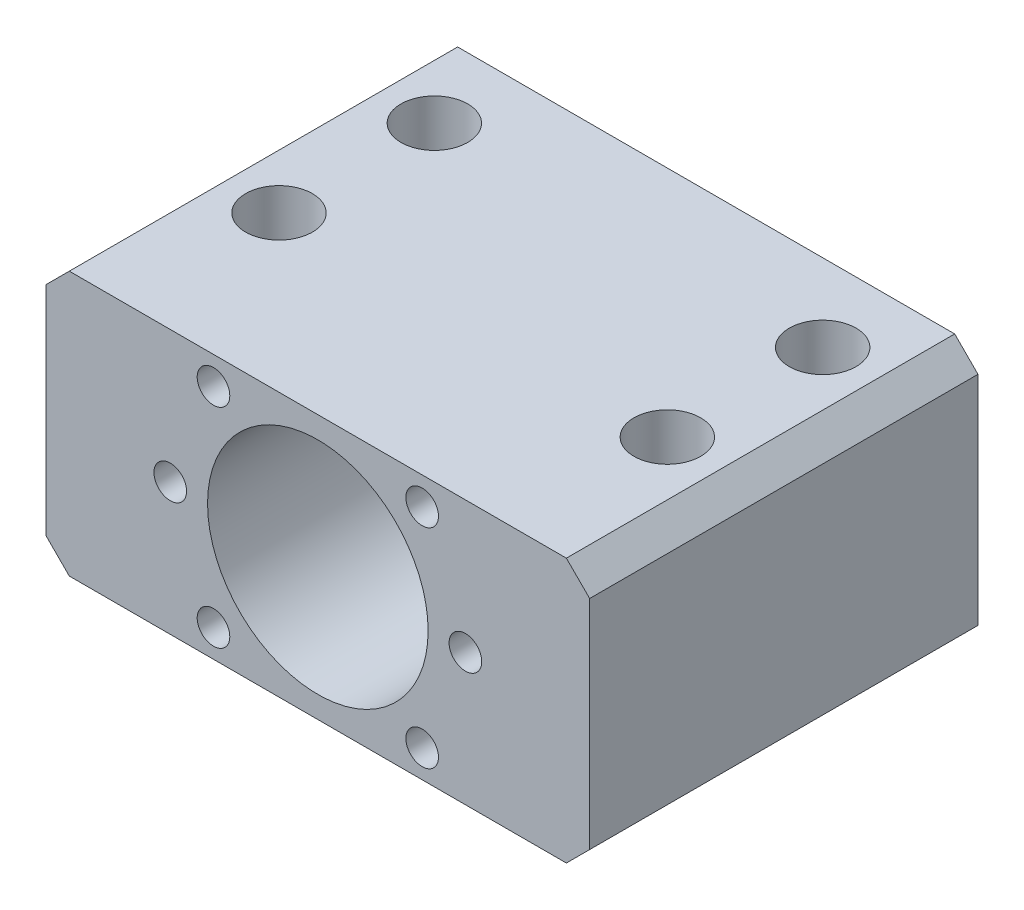
ISO-10303-21;
HEADER;
FILE_DESCRIPTION(('STEP AP214'),'2;1');
FILE_NAME('part.step','',(''),(''),'','','');
FILE_SCHEMA(('AUTOMOTIVE_DESIGN { 1 0 10303 214 1 1 1 1 }'));
ENDSEC;
DATA;
#1=APPLICATION_CONTEXT('core data for automotive mechanical design processes');
#2=APPLICATION_PROTOCOL_DEFINITION('international standard','automotive_design',2000,#1);
#3=PRODUCT_CONTEXT('',#1,'mechanical');
#4=PRODUCT('Part','Part','',(#3));
#5=PRODUCT_RELATED_PRODUCT_CATEGORY('part','',(#4));
#6=PRODUCT_DEFINITION_FORMATION('','',#4);
#7=PRODUCT_DEFINITION_CONTEXT('part definition',#1,'design');
#8=PRODUCT_DEFINITION('design','',#6,#7);
#9=PRODUCT_DEFINITION_SHAPE('','',#8);
#10=(LENGTH_UNIT() NAMED_UNIT(*) SI_UNIT(.MILLI.,.METRE.));
#11=(NAMED_UNIT(*) PLANE_ANGLE_UNIT() SI_UNIT($,.RADIAN.));
#12=(NAMED_UNIT(*) SI_UNIT($,.STERADIAN.) SOLID_ANGLE_UNIT());
#13=UNCERTAINTY_MEASURE_WITH_UNIT(LENGTH_MEASURE(1.E-05),#10,'distance_accuracy_value','');
#14=(GEOMETRIC_REPRESENTATION_CONTEXT(3) GLOBAL_UNCERTAINTY_ASSIGNED_CONTEXT((#13)) GLOBAL_UNIT_ASSIGNED_CONTEXT((#10,
#11,#12)) REPRESENTATION_CONTEXT('',''));
#15=CARTESIAN_POINT('',(0.,0.,0.));
#16=DIRECTION('',(0.,0.,1.));
#17=DIRECTION('',(1.,0.,0.));
#18=AXIS2_PLACEMENT_3D('',#15,#16,#17);
#19=CARTESIAN_POINT('',(-35.,24.,25.));
#20=DIRECTION('',(-1.,0.,0.));
#21=DIRECTION('',(0.,0.,1.));
#22=AXIS2_PLACEMENT_3D('',#19,#20,#21);
#23=PLANE('',#22);
#24=DIRECTION('',(0.,-1.,0.));
#25=VECTOR('',#24,1.);
#26=CARTESIAN_POINT('',(-35.,24.,-25.));
#27=LINE('',#26,#25);
#28=CARTESIAN_POINT('',(-35.,14.,-25.));
#29=VERTEX_POINT('',#28);
#30=CARTESIAN_POINT('',(-35.,-14.,-25.));
#31=VERTEX_POINT('',#30);
#32=EDGE_CURVE('E207',#29,#31,#27,.T.);
#33=ORIENTED_EDGE('',*,*,#32,.T.);
#34=DIRECTION('',(0.,0.,1.));
#35=VECTOR('',#34,1.);
#36=CARTESIAN_POINT('',(-35.,-14.,25.));
#37=LINE('',#36,#35);
#38=CARTESIAN_POINT('',(-35.,-14.,25.));
#39=VERTEX_POINT('',#38);
#40=EDGE_CURVE('E229',#31,#39,#37,.T.);
#41=ORIENTED_EDGE('',*,*,#40,.T.);
#42=DIRECTION('',(0.,-1.,0.));
#43=VECTOR('',#42,1.);
#44=CARTESIAN_POINT('',(-35.,24.,25.));
#45=LINE('',#44,#43);
#46=CARTESIAN_POINT('',(-35.,14.,25.));
#47=VERTEX_POINT('',#46);
#48=EDGE_CURVE('E208',#47,#39,#45,.T.);
#49=ORIENTED_EDGE('',*,*,#48,.F.);
#50=DIRECTION('',(0.,0.,-1.));
#51=VECTOR('',#50,1.);
#52=CARTESIAN_POINT('',(-35.,14.,-25.));
#53=LINE('',#52,#51);
#54=EDGE_CURVE('E211',#47,#29,#53,.T.);
#55=ORIENTED_EDGE('',*,*,#54,.T.);
#56=EDGE_LOOP('',(#33,#41,#49,#55));
#57=FACE_BOUND('',#56,.T.);
#58=ADVANCED_FACE('F35',(#57),#23,.T.);
#59=CARTESIAN_POINT('',(35.,24.,25.));
#60=DIRECTION('',(0.,0.,1.));
#61=DIRECTION('',(1.,0.,0.));
#62=AXIS2_PLACEMENT_3D('',#59,#60,#61);
#63=PLANE('',#62);
#64=ORIENTED_EDGE('',*,*,#48,.T.);
#65=DIRECTION('',(0.707106781186549,-0.707106781186546,0.));
#66=VECTOR('',#65,1.);
#67=CARTESIAN_POINT('',(-18.9999999999998,-30.0000000000001,25.));
#68=LINE('',#67,#66);
#69=CARTESIAN_POINT('',(-32.,-17.,25.));
#70=VERTEX_POINT('',#69);
#71=EDGE_CURVE('E238',#39,#70,#68,.T.);
#72=ORIENTED_EDGE('',*,*,#71,.T.);
#73=DIRECTION('',(-1.,0.,0.));
#74=VECTOR('',#73,1.);
#75=CARTESIAN_POINT('',(-35.,-17.,25.));
#76=LINE('',#75,#74);
#77=CARTESIAN_POINT('',(32.,-17.,25.));
#78=VERTEX_POINT('',#77);
#79=EDGE_CURVE('E284',#78,#70,#76,.T.);
#80=ORIENTED_EDGE('',*,*,#79,.F.);
#81=DIRECTION('',(0.707106781186546,0.707106781186549,0.));
#82=VECTOR('',#81,1.);
#83=CARTESIAN_POINT('',(54.,5.0000000000001,25.));
#84=LINE('',#83,#82);
#85=CARTESIAN_POINT('',(35.,-14.,25.));
#86=VERTEX_POINT('',#85);
#87=EDGE_CURVE('E236',#78,#86,#84,.T.);
#88=ORIENTED_EDGE('',*,*,#87,.T.);
#89=DIRECTION('',(0.,-1.,0.));
#90=VECTOR('',#89,1.);
#91=CARTESIAN_POINT('',(35.,24.,25.));
#92=LINE('',#91,#90);
#93=CARTESIAN_POINT('',(35.,14.,25.));
#94=VERTEX_POINT('',#93);
#95=EDGE_CURVE('E212',#94,#86,#92,.T.);
#96=ORIENTED_EDGE('',*,*,#95,.F.);
#97=DIRECTION('',(-0.707106781186549,0.707106781186546,0.));
#98=VECTOR('',#97,1.);
#99=CARTESIAN_POINT('',(30.,19.,25.));
#100=LINE('',#99,#98);
#101=CARTESIAN_POINT('',(32.,17.,25.));
#102=VERTEX_POINT('',#101);
#103=EDGE_CURVE('E234',#94,#102,#100,.T.);
#104=ORIENTED_EDGE('',*,*,#103,.T.);
#105=DIRECTION('',(1.,0.,0.));
#106=VECTOR('',#105,1.);
#107=CARTESIAN_POINT('',(-35.,17.,25.));
#108=LINE('',#107,#106);
#109=CARTESIAN_POINT('',(-32.,17.,25.));
#110=VERTEX_POINT('',#109);
#111=EDGE_CURVE('E271',#110,#102,#108,.T.);
#112=ORIENTED_EDGE('',*,*,#111,.F.);
#113=DIRECTION('',(-0.707106781186544,-0.707106781186551,0.));
#114=VECTOR('',#113,1.);
#115=CARTESIAN_POINT('',(4.99999999999968,54.,25.));
#116=LINE('',#115,#114);
#117=EDGE_CURVE('E232',#110,#47,#116,.T.);
#118=ORIENTED_EDGE('',*,*,#117,.T.);
#119=EDGE_LOOP('',(#64,#72,#80,#88,#96,#104,#112,#118));
#120=FACE_BOUND('',#119,.T.);
#121=CARTESIAN_POINT('',(13.435028843,-13.435028843,25.));
#122=DIRECTION('',(0.,0.,1.));
#123=DIRECTION('',(1.,0.,0.));
#124=AXIS2_PLACEMENT_3D('',#121,#122,#123);
#125=CIRCLE('',#124,2.09999999999999);
#126=CARTESIAN_POINT('',(15.535028843,-13.435028843,25.));
#127=VERTEX_POINT('',#126);
#128=EDGE_CURVE('E141',#127,#127,#125,.T.);
#129=ORIENTED_EDGE('',*,*,#128,.F.);
#130=EDGE_LOOP('',(#129));
#131=FACE_BOUND('',#130,.T.);
#132=CARTESIAN_POINT('',(13.435028843,13.435028843,25.));
#133=DIRECTION('',(0.,0.,1.));
#134=DIRECTION('',(1.,0.,0.));
#135=AXIS2_PLACEMENT_3D('',#132,#133,#134);
#136=CIRCLE('',#135,2.09999999999999);
#137=CARTESIAN_POINT('',(15.535028843,13.435028843,25.));
#138=VERTEX_POINT('',#137);
#139=EDGE_CURVE('E140',#138,#138,#136,.T.);
#140=ORIENTED_EDGE('',*,*,#139,.F.);
#141=EDGE_LOOP('',(#140));
#142=FACE_BOUND('',#141,.T.);
#143=CARTESIAN_POINT('',(19.,0.,25.));
#144=DIRECTION('',(0.,0.,1.));
#145=DIRECTION('',(1.,0.,0.));
#146=AXIS2_PLACEMENT_3D('',#143,#144,#145);
#147=CIRCLE('',#146,2.09999999999999);
#148=CARTESIAN_POINT('',(21.1,0.,25.));
#149=VERTEX_POINT('',#148);
#150=EDGE_CURVE('E153',#149,#149,#147,.T.);
#151=ORIENTED_EDGE('',*,*,#150,.F.);
#152=EDGE_LOOP('',(#151));
#153=FACE_BOUND('',#152,.T.);
#154=CARTESIAN_POINT('',(-13.435028843,13.435028843,25.));
#155=DIRECTION('',(0.,0.,1.));
#156=DIRECTION('',(1.,0.,0.));
#157=AXIS2_PLACEMENT_3D('',#154,#155,#156);
#158=CIRCLE('',#157,2.09999999999999);
#159=CARTESIAN_POINT('',(-11.335028843,13.435028843,25.));
#160=VERTEX_POINT('',#159);
#161=EDGE_CURVE('E159',#160,#160,#158,.T.);
#162=ORIENTED_EDGE('',*,*,#161,.F.);
#163=EDGE_LOOP('',(#162));
#164=FACE_BOUND('',#163,.T.);
#165=CARTESIAN_POINT('',(-13.435028843,-13.435028843,25.));
#166=DIRECTION('',(0.,0.,1.));
#167=DIRECTION('',(1.,0.,0.));
#168=AXIS2_PLACEMENT_3D('',#165,#166,#167);
#169=CIRCLE('',#168,2.09999999999999);
#170=CARTESIAN_POINT('',(-11.335028843,-13.435028843,25.));
#171=VERTEX_POINT('',#170);
#172=EDGE_CURVE('E165',#171,#171,#169,.T.);
#173=ORIENTED_EDGE('',*,*,#172,.F.);
#174=EDGE_LOOP('',(#173));
#175=FACE_BOUND('',#174,.T.);
#176=CARTESIAN_POINT('',(-19.,0.,25.));
#177=DIRECTION('',(0.,0.,1.));
#178=DIRECTION('',(1.,0.,0.));
#179=AXIS2_PLACEMENT_3D('',#176,#177,#178);
#180=CIRCLE('',#179,2.09999999999999);
#181=CARTESIAN_POINT('',(-16.9,0.,25.));
#182=VERTEX_POINT('',#181);
#183=EDGE_CURVE('E171',#182,#182,#180,.T.);
#184=ORIENTED_EDGE('',*,*,#183,.F.);
#185=EDGE_LOOP('',(#184));
#186=FACE_BOUND('',#185,.T.);
#187=CARTESIAN_POINT('',(0.,0.,25.));
#188=DIRECTION('',(0.,0.,-1.));
#189=DIRECTION('',(-1.,0.,0.));
#190=AXIS2_PLACEMENT_3D('',#187,#188,#189);
#191=CIRCLE('',#190,14.2);
#192=CARTESIAN_POINT('',(-14.2,0.,25.));
#193=VERTEX_POINT('',#192);
#194=EDGE_CURVE('E180',#193,#193,#191,.T.);
#195=ORIENTED_EDGE('',*,*,#194,.T.);
#196=EDGE_LOOP('',(#195));
#197=FACE_BOUND('',#196,.T.);
#198=ADVANCED_FACE('F276',(#120,#131,#142,#153,#164,#175,#186,#197),#63,.T.);
#199=CARTESIAN_POINT('',(35.,24.,-25.));
#200=DIRECTION('',(1.,0.,0.));
#201=DIRECTION('',(0.,0.,-1.));
#202=AXIS2_PLACEMENT_3D('',#199,#200,#201);
#203=PLANE('',#202);
#204=ORIENTED_EDGE('',*,*,#95,.T.);
#205=DIRECTION('',(0.,0.,-1.));
#206=VECTOR('',#205,1.);
#207=CARTESIAN_POINT('',(35.,-14.,-25.));
#208=LINE('',#207,#206);
#209=CARTESIAN_POINT('',(35.,-14.,-25.));
#210=VERTEX_POINT('',#209);
#211=EDGE_CURVE('E51',#86,#210,#208,.T.);
#212=ORIENTED_EDGE('',*,*,#211,.T.);
#213=DIRECTION('',(0.,-1.,0.));
#214=VECTOR('',#213,1.);
#215=CARTESIAN_POINT('',(35.,24.,-25.));
#216=LINE('',#215,#214);
#217=CARTESIAN_POINT('',(35.,14.,-25.));
#218=VERTEX_POINT('',#217);
#219=EDGE_CURVE('E214',#218,#210,#216,.T.);
#220=ORIENTED_EDGE('',*,*,#219,.F.);
#221=DIRECTION('',(0.,0.,1.));
#222=VECTOR('',#221,1.);
#223=CARTESIAN_POINT('',(35.,14.,25.));
#224=LINE('',#223,#222);
#225=EDGE_CURVE('E260',#218,#94,#224,.T.);
#226=ORIENTED_EDGE('',*,*,#225,.T.);
#227=EDGE_LOOP('',(#204,#212,#220,#226));
#228=FACE_BOUND('',#227,.T.);
#229=ADVANCED_FACE('F330',(#228),#203,.T.);
#230=CARTESIAN_POINT('',(-35.,24.,-25.));
#231=DIRECTION('',(0.,0.,-1.));
#232=DIRECTION('',(-1.,0.,0.));
#233=AXIS2_PLACEMENT_3D('',#230,#231,#232);
#234=PLANE('',#233);
#235=DIRECTION('',(-1.,0.,0.));
#236=VECTOR('',#235,1.);
#237=CARTESIAN_POINT('',(-35.,-17.,-25.));
#238=LINE('',#237,#236);
#239=CARTESIAN_POINT('',(32.,-17.,-25.));
#240=VERTEX_POINT('',#239);
#241=CARTESIAN_POINT('',(-32.,-17.,-25.));
#242=VERTEX_POINT('',#241);
#243=EDGE_CURVE('E280',#240,#242,#238,.T.);
#244=ORIENTED_EDGE('',*,*,#243,.T.);
#245=DIRECTION('',(-0.707106781186549,0.707106781186546,0.));
#246=VECTOR('',#245,1.);
#247=CARTESIAN_POINT('',(-54.,4.99999999999993,-25.));
#248=LINE('',#247,#246);
#249=EDGE_CURVE('E258',#242,#31,#248,.T.);
#250=ORIENTED_EDGE('',*,*,#249,.T.);
#251=ORIENTED_EDGE('',*,*,#32,.F.);
#252=DIRECTION('',(0.707106781186544,0.707106781186551,0.));
#253=VECTOR('',#252,1.);
#254=CARTESIAN_POINT('',(-30.,19.,-25.));
#255=LINE('',#254,#253);
#256=CARTESIAN_POINT('',(-32.,17.,-25.));
#257=VERTEX_POINT('',#256);
#258=EDGE_CURVE('E253',#29,#257,#255,.T.);
#259=ORIENTED_EDGE('',*,*,#258,.T.);
#260=DIRECTION('',(1.,0.,0.));
#261=VECTOR('',#260,1.);
#262=CARTESIAN_POINT('',(-35.,17.,-25.));
#263=LINE('',#262,#261);
#264=CARTESIAN_POINT('',(32.,17.,-25.));
#265=VERTEX_POINT('',#264);
#266=EDGE_CURVE('E222',#257,#265,#263,.T.);
#267=ORIENTED_EDGE('',*,*,#266,.T.);
#268=DIRECTION('',(0.707106781186549,-0.707106781186546,0.));
#269=VECTOR('',#268,1.);
#270=CARTESIAN_POINT('',(-5.00000000000016,54.,-25.));
#271=LINE('',#270,#269);
#272=EDGE_CURVE('E58',#265,#218,#271,.T.);
#273=ORIENTED_EDGE('',*,*,#272,.T.);
#274=ORIENTED_EDGE('',*,*,#219,.T.);
#275=DIRECTION('',(-0.707106781186546,-0.707106781186549,0.));
#276=VECTOR('',#275,1.);
#277=CARTESIAN_POINT('',(19.0000000000002,-29.9999999999999,-25.));
#278=LINE('',#277,#276);
#279=EDGE_CURVE('E256',#210,#240,#278,.T.);
#280=ORIENTED_EDGE('',*,*,#279,.T.);
#281=EDGE_LOOP('',(#244,#250,#251,#259,#267,#273,#274,#280));
#282=FACE_BOUND('',#281,.T.);
#283=CARTESIAN_POINT('',(0.,0.,-25.));
#284=DIRECTION('',(0.,0.,-1.));
#285=DIRECTION('',(-1.,0.,0.));
#286=AXIS2_PLACEMENT_3D('',#283,#284,#285);
#287=CIRCLE('',#286,14.2);
#288=CARTESIAN_POINT('',(-14.2,0.,-25.));
#289=VERTEX_POINT('',#288);
#290=EDGE_CURVE('E177',#289,#289,#287,.T.);
#291=ORIENTED_EDGE('',*,*,#290,.F.);
#292=EDGE_LOOP('',(#291));
#293=FACE_BOUND('',#292,.T.);
#294=ADVANCED_FACE('F334',(#282,#293),#234,.T.);
#295=CARTESIAN_POINT('',(0.,0.,-25.));
#296=DIRECTION('',(0.,0.,-1.));
#297=DIRECTION('',(-1.,0.,0.));
#298=AXIS2_PLACEMENT_3D('',#295,#296,#297);
#299=CYLINDRICAL_SURFACE('',#298,14.2);
#300=ORIENTED_EDGE('',*,*,#194,.F.);
#301=EDGE_LOOP('',(#300));
#302=FACE_BOUND('',#301,.T.);
#303=ORIENTED_EDGE('',*,*,#290,.T.);
#304=EDGE_LOOP('',(#303));
#305=FACE_BOUND('',#304,.T.);
#306=ADVANCED_FACE('F419',(#302,#305),#299,.F.);
#307=CARTESIAN_POINT('',(-19.,0.,11.));
#308=DIRECTION('',(0.,0.,1.));
#309=DIRECTION('',(1.,0.,0.));
#310=AXIS2_PLACEMENT_3D('',#307,#308,#309);
#311=CONICAL_SURFACE('',#310,2.09999999999999,1.02974425866172);
#312=CARTESIAN_POINT('',(-19.,0.,9.73819269999946));
#313=VERTEX_POINT('',#312);
#314=VERTEX_LOOP('',#313);
#315=FACE_BOUND('',#314,.T.);
#316=CARTESIAN_POINT('',(-19.,0.,11.));
#317=DIRECTION('',(0.,0.,1.));
#318=DIRECTION('',(1.,0.,0.));
#319=AXIS2_PLACEMENT_3D('',#316,#317,#318);
#320=CIRCLE('',#319,2.09999999999999);
#321=CARTESIAN_POINT('',(-16.9,0.,11.));
#322=VERTEX_POINT('',#321);
#323=EDGE_CURVE('E174',#322,#322,#320,.T.);
#324=ORIENTED_EDGE('',*,*,#323,.T.);
#325=EDGE_LOOP('',(#324));
#326=FACE_BOUND('',#325,.T.);
#327=ADVANCED_FACE('F423',(#315,#326),#311,.F.);
#328=CARTESIAN_POINT('',(-19.,0.,25.));
#329=DIRECTION('',(0.,0.,1.));
#330=DIRECTION('',(1.,0.,0.));
#331=AXIS2_PLACEMENT_3D('',#328,#329,#330);
#332=CYLINDRICAL_SURFACE('',#331,2.09999999999999);
#333=ORIENTED_EDGE('',*,*,#323,.F.);
#334=EDGE_LOOP('',(#333));
#335=FACE_BOUND('',#334,.T.);
#336=ORIENTED_EDGE('',*,*,#183,.T.);
#337=EDGE_LOOP('',(#336));
#338=FACE_BOUND('',#337,.T.);
#339=ADVANCED_FACE('F429',(#335,#338),#332,.F.);
#340=CARTESIAN_POINT('',(-13.435028843,-13.435028843,11.));
#341=DIRECTION('',(0.,0.,1.));
#342=DIRECTION('',(1.,0.,0.));
#343=AXIS2_PLACEMENT_3D('',#340,#341,#342);
#344=CONICAL_SURFACE('',#343,2.09999999999999,1.02974425866172);
#345=CARTESIAN_POINT('',(-13.435028843,-13.435028843,9.73819269999946));
#346=VERTEX_POINT('',#345);
#347=VERTEX_LOOP('',#346);
#348=FACE_BOUND('',#347,.T.);
#349=CARTESIAN_POINT('',(-13.435028843,-13.435028843,11.));
#350=DIRECTION('',(0.,0.,1.));
#351=DIRECTION('',(1.,0.,0.));
#352=AXIS2_PLACEMENT_3D('',#349,#350,#351);
#353=CIRCLE('',#352,2.09999999999999);
#354=CARTESIAN_POINT('',(-11.335028843,-13.435028843,11.));
#355=VERTEX_POINT('',#354);
#356=EDGE_CURVE('E168',#355,#355,#353,.T.);
#357=ORIENTED_EDGE('',*,*,#356,.T.);
#358=EDGE_LOOP('',(#357));
#359=FACE_BOUND('',#358,.T.);
#360=ADVANCED_FACE('F572',(#348,#359),#344,.F.);
#361=CARTESIAN_POINT('',(-13.435028843,-13.435028843,25.));
#362=DIRECTION('',(0.,0.,1.));
#363=DIRECTION('',(1.,0.,0.));
#364=AXIS2_PLACEMENT_3D('',#361,#362,#363);
#365=CYLINDRICAL_SURFACE('',#364,2.09999999999999);
#366=ORIENTED_EDGE('',*,*,#356,.F.);
#367=EDGE_LOOP('',(#366));
#368=FACE_BOUND('',#367,.T.);
#369=ORIENTED_EDGE('',*,*,#172,.T.);
#370=EDGE_LOOP('',(#369));
#371=FACE_BOUND('',#370,.T.);
#372=ADVANCED_FACE('F563',(#368,#371),#365,.F.);
#373=CARTESIAN_POINT('',(-13.435028843,13.435028843,11.));
#374=DIRECTION('',(0.,0.,1.));
#375=DIRECTION('',(1.,0.,0.));
#376=AXIS2_PLACEMENT_3D('',#373,#374,#375);
#377=CONICAL_SURFACE('',#376,2.09999999999999,1.02974425866172);
#378=CARTESIAN_POINT('',(-13.435028843,13.435028843,9.73819269999946));
#379=VERTEX_POINT('',#378);
#380=VERTEX_LOOP('',#379);
#381=FACE_BOUND('',#380,.T.);
#382=CARTESIAN_POINT('',(-13.435028843,13.435028843,11.));
#383=DIRECTION('',(0.,0.,1.));
#384=DIRECTION('',(1.,0.,0.));
#385=AXIS2_PLACEMENT_3D('',#382,#383,#384);
#386=CIRCLE('',#385,2.09999999999999);
#387=CARTESIAN_POINT('',(-11.335028843,13.435028843,11.));
#388=VERTEX_POINT('',#387);
#389=EDGE_CURVE('E162',#388,#388,#386,.T.);
#390=ORIENTED_EDGE('',*,*,#389,.T.);
#391=EDGE_LOOP('',(#390));
#392=FACE_BOUND('',#391,.T.);
#393=ADVANCED_FACE('F554',(#381,#392),#377,.F.);
#394=CARTESIAN_POINT('',(-13.435028843,13.435028843,25.));
#395=DIRECTION('',(0.,0.,1.));
#396=DIRECTION('',(1.,0.,0.));
#397=AXIS2_PLACEMENT_3D('',#394,#395,#396);
#398=CYLINDRICAL_SURFACE('',#397,2.09999999999999);
#399=ORIENTED_EDGE('',*,*,#389,.F.);
#400=EDGE_LOOP('',(#399));
#401=FACE_BOUND('',#400,.T.);
#402=ORIENTED_EDGE('',*,*,#161,.T.);
#403=EDGE_LOOP('',(#402));
#404=FACE_BOUND('',#403,.T.);
#405=ADVANCED_FACE('F545',(#401,#404),#398,.F.);
#406=CARTESIAN_POINT('',(19.,0.,11.));
#407=DIRECTION('',(0.,0.,1.));
#408=DIRECTION('',(1.,0.,0.));
#409=AXIS2_PLACEMENT_3D('',#406,#407,#408);
#410=CONICAL_SURFACE('',#409,2.09999999999999,1.02974425866172);
#411=CARTESIAN_POINT('',(19.,0.,9.73819269999946));
#412=VERTEX_POINT('',#411);
#413=VERTEX_LOOP('',#412);
#414=FACE_BOUND('',#413,.T.);
#415=CARTESIAN_POINT('',(19.,0.,11.));
#416=DIRECTION('',(0.,0.,1.));
#417=DIRECTION('',(1.,0.,0.));
#418=AXIS2_PLACEMENT_3D('',#415,#416,#417);
#419=CIRCLE('',#418,2.09999999999999);
#420=CARTESIAN_POINT('',(21.1,0.,11.));
#421=VERTEX_POINT('',#420);
#422=EDGE_CURVE('E156',#421,#421,#419,.T.);
#423=ORIENTED_EDGE('',*,*,#422,.T.);
#424=EDGE_LOOP('',(#423));
#425=FACE_BOUND('',#424,.T.);
#426=ADVANCED_FACE('F536',(#414,#425),#410,.F.);
#427=CARTESIAN_POINT('',(19.,0.,25.));
#428=DIRECTION('',(0.,0.,1.));
#429=DIRECTION('',(1.,0.,0.));
#430=AXIS2_PLACEMENT_3D('',#427,#428,#429);
#431=CYLINDRICAL_SURFACE('',#430,2.09999999999999);
#432=ORIENTED_EDGE('',*,*,#422,.F.);
#433=EDGE_LOOP('',(#432));
#434=FACE_BOUND('',#433,.T.);
#435=ORIENTED_EDGE('',*,*,#150,.T.);
#436=EDGE_LOOP('',(#435));
#437=FACE_BOUND('',#436,.T.);
#438=ADVANCED_FACE('F527',(#434,#437),#431,.F.);
#439=CARTESIAN_POINT('',(13.435028843,13.435028843,11.));
#440=DIRECTION('',(0.,0.,1.));
#441=DIRECTION('',(1.,0.,0.));
#442=AXIS2_PLACEMENT_3D('',#439,#440,#441);
#443=CONICAL_SURFACE('',#442,2.09999999999999,1.02974425866172);
#444=CARTESIAN_POINT('',(13.435028843,13.435028843,9.73819269999946));
#445=VERTEX_POINT('',#444);
#446=VERTEX_LOOP('',#445);
#447=FACE_BOUND('',#446,.T.);
#448=CARTESIAN_POINT('',(13.435028843,13.435028843,11.));
#449=DIRECTION('',(0.,0.,1.));
#450=DIRECTION('',(1.,0.,0.));
#451=AXIS2_PLACEMENT_3D('',#448,#449,#450);
#452=CIRCLE('',#451,2.09999999999999);
#453=CARTESIAN_POINT('',(15.535028843,13.435028843,11.));
#454=VERTEX_POINT('',#453);
#455=EDGE_CURVE('E144',#454,#454,#452,.T.);
#456=ORIENTED_EDGE('',*,*,#455,.T.);
#457=EDGE_LOOP('',(#456));
#458=FACE_BOUND('',#457,.T.);
#459=ADVANCED_FACE('F518',(#447,#458),#443,.F.);
#460=CARTESIAN_POINT('',(13.435028843,13.435028843,25.));
#461=DIRECTION('',(0.,0.,1.));
#462=DIRECTION('',(1.,0.,0.));
#463=AXIS2_PLACEMENT_3D('',#460,#461,#462);
#464=CYLINDRICAL_SURFACE('',#463,2.09999999999999);
#465=ORIENTED_EDGE('',*,*,#455,.F.);
#466=EDGE_LOOP('',(#465));
#467=FACE_BOUND('',#466,.T.);
#468=ORIENTED_EDGE('',*,*,#139,.T.);
#469=EDGE_LOOP('',(#468));
#470=FACE_BOUND('',#469,.T.);
#471=ADVANCED_FACE('F134',(#467,#470),#464,.F.);
#472=CARTESIAN_POINT('',(13.435028843,-13.435028843,11.));
#473=DIRECTION('',(0.,0.,1.));
#474=DIRECTION('',(1.,0.,0.));
#475=AXIS2_PLACEMENT_3D('',#472,#473,#474);
#476=CONICAL_SURFACE('',#475,2.09999999999999,1.02974425866172);
#477=CARTESIAN_POINT('',(13.435028843,-13.435028843,9.73819269999946));
#478=VERTEX_POINT('',#477);
#479=VERTEX_LOOP('',#478);
#480=FACE_BOUND('',#479,.T.);
#481=CARTESIAN_POINT('',(13.435028843,-13.435028843,11.));
#482=DIRECTION('',(0.,0.,1.));
#483=DIRECTION('',(1.,0.,0.));
#484=AXIS2_PLACEMENT_3D('',#481,#482,#483);
#485=CIRCLE('',#484,2.09999999999999);
#486=CARTESIAN_POINT('',(15.535028843,-13.435028843,11.));
#487=VERTEX_POINT('',#486);
#488=EDGE_CURVE('E138',#487,#487,#485,.T.);
#489=ORIENTED_EDGE('',*,*,#488,.T.);
#490=EDGE_LOOP('',(#489));
#491=FACE_BOUND('',#490,.T.);
#492=ADVANCED_FACE('F130',(#480,#491),#476,.F.);
#493=CARTESIAN_POINT('',(13.435028843,-13.435028843,25.));
#494=DIRECTION('',(0.,0.,1.));
#495=DIRECTION('',(1.,0.,0.));
#496=AXIS2_PLACEMENT_3D('',#493,#494,#495);
#497=CYLINDRICAL_SURFACE('',#496,2.09999999999999);
#498=ORIENTED_EDGE('',*,*,#488,.F.);
#499=EDGE_LOOP('',(#498));
#500=FACE_BOUND('',#499,.T.);
#501=ORIENTED_EDGE('',*,*,#128,.T.);
#502=EDGE_LOOP('',(#501));
#503=FACE_BOUND('',#502,.T.);
#504=ADVANCED_FACE('F133',(#500,#503),#497,.F.);
#505=CARTESIAN_POINT('',(-35.,-17.,-25.));
#506=DIRECTION('',(0.,1.,0.));
#507=DIRECTION('',(-1.,0.,0.));
#508=AXIS2_PLACEMENT_3D('',#505,#506,#507);
#509=PLANE('',#508);
#510=ORIENTED_EDGE('',*,*,#79,.T.);
#511=DIRECTION('',(0.,0.,-1.));
#512=VECTOR('',#511,1.);
#513=CARTESIAN_POINT('',(-32.,-17.,-25.));
#514=LINE('',#513,#512);
#515=CARTESIAN_POINT('',(-32.,-17.,5.));
#516=VERTEX_POINT('',#515);
#517=EDGE_CURVE('E251',#70,#516,#514,.T.);
#518=ORIENTED_EDGE('',*,*,#517,.T.);
#519=CARTESIAN_POINT('',(-25.,-17.,5.));
#520=DIRECTION('',(0.,1.,0.));
#521=DIRECTION('',(-1.,0.,0.));
#522=AXIS2_PLACEMENT_3D('',#519,#520,#521);
#523=CIRCLE('',#522,7.);
#524=EDGE_CURVE('E218',#516,#516,#523,.F.);
#525=ORIENTED_EDGE('',*,*,#524,.F.);
#526=DIRECTION('',(0.,0.,-1.));
#527=VECTOR('',#526,1.);
#528=CARTESIAN_POINT('',(-32.,-17.,-25.));
#529=LINE('',#528,#527);
#530=CARTESIAN_POINT('',(-32.,-17.,-15.));
#531=VERTEX_POINT('',#530);
#532=EDGE_CURVE('E249',#516,#531,#529,.T.);
#533=ORIENTED_EDGE('',*,*,#532,.T.);
#534=CARTESIAN_POINT('',(-25.,-17.,-15.));
#535=DIRECTION('',(0.,1.,0.));
#536=DIRECTION('',(-1.,0.,0.));
#537=AXIS2_PLACEMENT_3D('',#534,#535,#536);
#538=CIRCLE('',#537,7.);
#539=EDGE_CURVE('E227',#531,#531,#538,.F.);
#540=ORIENTED_EDGE('',*,*,#539,.F.);
#541=DIRECTION('',(0.,0.,-1.));
#542=VECTOR('',#541,1.);
#543=CARTESIAN_POINT('',(-32.,-17.,-25.));
#544=LINE('',#543,#542);
#545=EDGE_CURVE('E247',#531,#242,#544,.T.);
#546=ORIENTED_EDGE('',*,*,#545,.T.);
#547=ORIENTED_EDGE('',*,*,#243,.F.);
#548=DIRECTION('',(0.,0.,1.));
#549=VECTOR('',#548,1.);
#550=CARTESIAN_POINT('',(32.,-17.,25.));
#551=LINE('',#550,#549);
#552=CARTESIAN_POINT('',(32.,-17.,-15.));
#553=VERTEX_POINT('',#552);
#554=EDGE_CURVE('E244',#240,#553,#551,.T.);
#555=ORIENTED_EDGE('',*,*,#554,.T.);
#556=CARTESIAN_POINT('',(25.,-17.,-15.));
#557=DIRECTION('',(0.,1.,0.));
#558=DIRECTION('',(-1.,0.,0.));
#559=AXIS2_PLACEMENT_3D('',#556,#557,#558);
#560=CIRCLE('',#559,7.);
#561=EDGE_CURVE('E291',#553,#553,#560,.F.);
#562=ORIENTED_EDGE('',*,*,#561,.F.);
#563=DIRECTION('',(0.,0.,1.));
#564=VECTOR('',#563,1.);
#565=CARTESIAN_POINT('',(32.,-17.,25.));
#566=LINE('',#565,#564);
#567=CARTESIAN_POINT('',(32.,-17.,5.));
#568=VERTEX_POINT('',#567);
#569=EDGE_CURVE('E242',#553,#568,#566,.T.);
#570=ORIENTED_EDGE('',*,*,#569,.T.);
#571=CARTESIAN_POINT('',(25.,-17.,5.));
#572=DIRECTION('',(0.,1.,0.));
#573=DIRECTION('',(-1.,0.,0.));
#574=AXIS2_PLACEMENT_3D('',#571,#572,#573);
#575=CIRCLE('',#574,7.);
#576=EDGE_CURVE('E221',#568,#568,#575,.F.);
#577=ORIENTED_EDGE('',*,*,#576,.F.);
#578=DIRECTION('',(0.,0.,1.));
#579=VECTOR('',#578,1.);
#580=CARTESIAN_POINT('',(32.,-17.,25.));
#581=LINE('',#580,#579);
#582=EDGE_CURVE('E240',#568,#78,#581,.T.);
#583=ORIENTED_EDGE('',*,*,#582,.T.);
#584=EDGE_LOOP('',(#510,#518,#525,#533,#540,#546,#547,#555,#562,#570,#577,#583));
#585=FACE_BOUND('',#584,.T.);
#586=ADVANCED_FACE('F308',(#585),#509,.F.);
#587=CARTESIAN_POINT('',(-35.,17.,-25.));
#588=DIRECTION('',(0.,-1.,0.));
#589=DIRECTION('',(0.,0.,-1.));
#590=AXIS2_PLACEMENT_3D('',#587,#588,#589);
#591=PLANE('',#590);
#592=CARTESIAN_POINT('',(25.,17.,-15.));
#593=DIRECTION('',(0.,-1.,0.));
#594=DIRECTION('',(0.,0.,-1.));
#595=AXIS2_PLACEMENT_3D('',#592,#593,#594);
#596=CIRCLE('',#595,4.3);
#597=CARTESIAN_POINT('',(25.,17.,-19.3));
#598=VERTEX_POINT('',#597);
#599=EDGE_CURVE('E298',#598,#598,#596,.F.);
#600=ORIENTED_EDGE('',*,*,#599,.F.);
#601=EDGE_LOOP('',(#600));
#602=FACE_BOUND('',#601,.T.);
#603=CARTESIAN_POINT('',(-25.,17.,5.));
#604=DIRECTION('',(0.,-1.,0.));
#605=DIRECTION('',(0.,0.,-1.));
#606=AXIS2_PLACEMENT_3D('',#603,#604,#605);
#607=CIRCLE('',#606,4.3);
#608=CARTESIAN_POINT('',(-25.,17.,0.7));
#609=VERTEX_POINT('',#608);
#610=EDGE_CURVE('E223',#609,#609,#607,.F.);
#611=ORIENTED_EDGE('',*,*,#610,.F.);
#612=EDGE_LOOP('',(#611));
#613=FACE_BOUND('',#612,.T.);
#614=ORIENTED_EDGE('',*,*,#111,.T.);
#615=DIRECTION('',(0.,0.,-1.));
#616=VECTOR('',#615,1.);
#617=CARTESIAN_POINT('',(32.,17.,-25.));
#618=LINE('',#617,#616);
#619=EDGE_CURVE('E11',#102,#265,#618,.T.);
#620=ORIENTED_EDGE('',*,*,#619,.T.);
#621=ORIENTED_EDGE('',*,*,#266,.F.);
#622=DIRECTION('',(0.,0.,1.));
#623=VECTOR('',#622,1.);
#624=CARTESIAN_POINT('',(-32.,17.,25.));
#625=LINE('',#624,#623);
#626=EDGE_CURVE('E44',#257,#110,#625,.T.);
#627=ORIENTED_EDGE('',*,*,#626,.T.);
#628=EDGE_LOOP('',(#614,#620,#621,#627));
#629=FACE_BOUND('',#628,.T.);
#630=CARTESIAN_POINT('',(25.,17.,5.));
#631=DIRECTION('',(0.,-1.,0.));
#632=DIRECTION('',(0.,0.,-1.));
#633=AXIS2_PLACEMENT_3D('',#630,#631,#632);
#634=CIRCLE('',#633,4.3);
#635=CARTESIAN_POINT('',(25.,17.,0.7));
#636=VERTEX_POINT('',#635);
#637=EDGE_CURVE('E226',#636,#636,#634,.F.);
#638=ORIENTED_EDGE('',*,*,#637,.F.);
#639=EDGE_LOOP('',(#638));
#640=FACE_BOUND('',#639,.T.);
#641=CARTESIAN_POINT('',(-25.,17.,-15.));
#642=DIRECTION('',(0.,-1.,0.));
#643=DIRECTION('',(0.,0.,-1.));
#644=AXIS2_PLACEMENT_3D('',#641,#642,#643);
#645=CIRCLE('',#644,4.3);
#646=CARTESIAN_POINT('',(-25.,17.,-19.3));
#647=VERTEX_POINT('',#646);
#648=EDGE_CURVE('E147',#647,#647,#645,.F.);
#649=ORIENTED_EDGE('',*,*,#648,.F.);
#650=EDGE_LOOP('',(#649));
#651=FACE_BOUND('',#650,.T.);
#652=ADVANCED_FACE('F269',(#602,#613,#629,#640,#651),#591,.F.);
#653=CARTESIAN_POINT('',(25.,-24.,5.));
#654=DIRECTION('',(0.,-1.,0.));
#655=DIRECTION('',(0.,0.,-1.));
#656=AXIS2_PLACEMENT_3D('',#653,#654,#655);
#657=CYLINDRICAL_SURFACE('',#656,4.3);
#658=ORIENTED_EDGE('',*,*,#637,.T.);
#659=EDGE_LOOP('',(#658));
#660=FACE_BOUND('',#659,.T.);
#661=CARTESIAN_POINT('',(25.,-13.,5.));
#662=DIRECTION('',(0.,-1.,0.));
#663=DIRECTION('',(0.,0.,-1.));
#664=AXIS2_PLACEMENT_3D('',#661,#662,#663);
#665=CIRCLE('',#664,4.30000000000001);
#666=CARTESIAN_POINT('',(25.,-13.,0.699999999999995));
#667=VERTEX_POINT('',#666);
#668=EDGE_CURVE('E192',#667,#667,#665,.T.);
#669=ORIENTED_EDGE('',*,*,#668,.T.);
#670=EDGE_LOOP('',(#669));
#671=FACE_BOUND('',#670,.T.);
#672=ADVANCED_FACE('F307',(#660,#671),#657,.F.);
#673=CARTESIAN_POINT('',(29.3,-13.,5.));
#674=DIRECTION('',(0.,1.,0.));
#675=DIRECTION('',(0.,0.,1.));
#676=AXIS2_PLACEMENT_3D('',#673,#674,#675);
#677=PLANE('',#676);
#678=ORIENTED_EDGE('',*,*,#668,.F.);
#679=EDGE_LOOP('',(#678));
#680=FACE_BOUND('',#679,.T.);
#681=CARTESIAN_POINT('',(25.,-13.,5.));
#682=DIRECTION('',(0.,-1.,0.));
#683=DIRECTION('',(0.,0.,-1.));
#684=AXIS2_PLACEMENT_3D('',#681,#682,#683);
#685=CIRCLE('',#684,7.);
#686=CARTESIAN_POINT('',(25.,-13.,-2.));
#687=VERTEX_POINT('',#686);
#688=EDGE_CURVE('E189',#687,#687,#685,.T.);
#689=ORIENTED_EDGE('',*,*,#688,.T.);
#690=EDGE_LOOP('',(#689));
#691=FACE_BOUND('',#690,.T.);
#692=ADVANCED_FACE('F316',(#680,#691),#677,.F.);
#693=CARTESIAN_POINT('',(25.,-24.,5.));
#694=DIRECTION('',(0.,-1.,0.));
#695=DIRECTION('',(0.,0.,-1.));
#696=AXIS2_PLACEMENT_3D('',#693,#694,#695);
#697=CYLINDRICAL_SURFACE('',#696,7.);
#698=ORIENTED_EDGE('',*,*,#576,.T.);
#699=EDGE_LOOP('',(#698));
#700=FACE_BOUND('',#699,.T.);
#701=ORIENTED_EDGE('',*,*,#688,.F.);
#702=EDGE_LOOP('',(#701));
#703=FACE_BOUND('',#702,.T.);
#704=ADVANCED_FACE('F379',(#700,#703),#697,.F.);
#705=CARTESIAN_POINT('',(25.,-24.,-15.));
#706=DIRECTION('',(0.,-1.,0.));
#707=DIRECTION('',(0.,0.,-1.));
#708=AXIS2_PLACEMENT_3D('',#705,#706,#707);
#709=CYLINDRICAL_SURFACE('',#708,4.3);
#710=ORIENTED_EDGE('',*,*,#599,.T.);
#711=EDGE_LOOP('',(#710));
#712=FACE_BOUND('',#711,.T.);
#713=CARTESIAN_POINT('',(25.,-13.,-15.));
#714=DIRECTION('',(0.,-1.,0.));
#715=DIRECTION('',(0.,0.,-1.));
#716=AXIS2_PLACEMENT_3D('',#713,#714,#715);
#717=CIRCLE('',#716,4.30000000000001);
#718=CARTESIAN_POINT('',(25.,-13.,-19.3));
#719=VERTEX_POINT('',#718);
#720=EDGE_CURVE('E198',#719,#719,#717,.T.);
#721=ORIENTED_EDGE('',*,*,#720,.T.);
#722=EDGE_LOOP('',(#721));
#723=FACE_BOUND('',#722,.T.);
#724=ADVANCED_FACE('F381',(#712,#723),#709,.F.);
#725=CARTESIAN_POINT('',(29.3,-13.,-15.));
#726=DIRECTION('',(0.,1.,0.));
#727=DIRECTION('',(0.,0.,1.));
#728=AXIS2_PLACEMENT_3D('',#725,#726,#727);
#729=PLANE('',#728);
#730=ORIENTED_EDGE('',*,*,#720,.F.);
#731=EDGE_LOOP('',(#730));
#732=FACE_BOUND('',#731,.T.);
#733=CARTESIAN_POINT('',(25.,-13.,-15.));
#734=DIRECTION('',(0.,-1.,0.));
#735=DIRECTION('',(0.,0.,-1.));
#736=AXIS2_PLACEMENT_3D('',#733,#734,#735);
#737=CIRCLE('',#736,7.);
#738=CARTESIAN_POINT('',(25.,-13.,-22.));
#739=VERTEX_POINT('',#738);
#740=EDGE_CURVE('E195',#739,#739,#737,.T.);
#741=ORIENTED_EDGE('',*,*,#740,.T.);
#742=EDGE_LOOP('',(#741));
#743=FACE_BOUND('',#742,.T.);
#744=ADVANCED_FACE('F397',(#732,#743),#729,.F.);
#745=CARTESIAN_POINT('',(25.,-24.,-15.));
#746=DIRECTION('',(0.,-1.,0.));
#747=DIRECTION('',(0.,0.,-1.));
#748=AXIS2_PLACEMENT_3D('',#745,#746,#747);
#749=CYLINDRICAL_SURFACE('',#748,7.);
#750=ORIENTED_EDGE('',*,*,#561,.T.);
#751=EDGE_LOOP('',(#750));
#752=FACE_BOUND('',#751,.T.);
#753=ORIENTED_EDGE('',*,*,#740,.F.);
#754=EDGE_LOOP('',(#753));
#755=FACE_BOUND('',#754,.T.);
#756=ADVANCED_FACE('F394',(#752,#755),#749,.F.);
#757=CARTESIAN_POINT('',(-25.,-24.,-15.));
#758=DIRECTION('',(0.,-1.,0.));
#759=DIRECTION('',(0.,0.,-1.));
#760=AXIS2_PLACEMENT_3D('',#757,#758,#759);
#761=CYLINDRICAL_SURFACE('',#760,4.3);
#762=ORIENTED_EDGE('',*,*,#648,.T.);
#763=EDGE_LOOP('',(#762));
#764=FACE_BOUND('',#763,.T.);
#765=CARTESIAN_POINT('',(-25.,-13.,-15.));
#766=DIRECTION('',(0.,-1.,0.));
#767=DIRECTION('',(0.,0.,-1.));
#768=AXIS2_PLACEMENT_3D('',#765,#766,#767);
#769=CIRCLE('',#768,4.30000000000001);
#770=CARTESIAN_POINT('',(-25.,-13.,-19.3));
#771=VERTEX_POINT('',#770);
#772=EDGE_CURVE('E204',#771,#771,#769,.T.);
#773=ORIENTED_EDGE('',*,*,#772,.T.);
#774=EDGE_LOOP('',(#773));
#775=FACE_BOUND('',#774,.T.);
#776=ADVANCED_FACE('F303',(#764,#775),#761,.F.);
#777=CARTESIAN_POINT('',(-20.7,-13.,-15.));
#778=DIRECTION('',(0.,1.,0.));
#779=DIRECTION('',(0.,0.,1.));
#780=AXIS2_PLACEMENT_3D('',#777,#778,#779);
#781=PLANE('',#780);
#782=ORIENTED_EDGE('',*,*,#772,.F.);
#783=EDGE_LOOP('',(#782));
#784=FACE_BOUND('',#783,.T.);
#785=CARTESIAN_POINT('',(-25.,-13.,-15.));
#786=DIRECTION('',(0.,-1.,0.));
#787=DIRECTION('',(0.,0.,-1.));
#788=AXIS2_PLACEMENT_3D('',#785,#786,#787);
#789=CIRCLE('',#788,7.);
#790=CARTESIAN_POINT('',(-25.,-13.,-22.));
#791=VERTEX_POINT('',#790);
#792=EDGE_CURVE('E201',#791,#791,#789,.T.);
#793=ORIENTED_EDGE('',*,*,#792,.T.);
#794=EDGE_LOOP('',(#793));
#795=FACE_BOUND('',#794,.T.);
#796=ADVANCED_FACE('F409',(#784,#795),#781,.F.);
#797=CARTESIAN_POINT('',(-25.,-24.,-15.));
#798=DIRECTION('',(0.,-1.,0.));
#799=DIRECTION('',(0.,0.,-1.));
#800=AXIS2_PLACEMENT_3D('',#797,#798,#799);
#801=CYLINDRICAL_SURFACE('',#800,7.);
#802=ORIENTED_EDGE('',*,*,#539,.T.);
#803=EDGE_LOOP('',(#802));
#804=FACE_BOUND('',#803,.T.);
#805=ORIENTED_EDGE('',*,*,#792,.F.);
#806=EDGE_LOOP('',(#805));
#807=FACE_BOUND('',#806,.T.);
#808=ADVANCED_FACE('F405',(#804,#807),#801,.F.);
#809=CARTESIAN_POINT('',(-25.,-24.,5.));
#810=DIRECTION('',(0.,-1.,0.));
#811=DIRECTION('',(0.,0.,-1.));
#812=AXIS2_PLACEMENT_3D('',#809,#810,#811);
#813=CYLINDRICAL_SURFACE('',#812,4.3);
#814=ORIENTED_EDGE('',*,*,#610,.T.);
#815=EDGE_LOOP('',(#814));
#816=FACE_BOUND('',#815,.T.);
#817=CARTESIAN_POINT('',(-25.,-13.,5.));
#818=DIRECTION('',(0.,-1.,0.));
#819=DIRECTION('',(0.,0.,-1.));
#820=AXIS2_PLACEMENT_3D('',#817,#818,#819);
#821=CIRCLE('',#820,4.30000000000001);
#822=CARTESIAN_POINT('',(-25.,-13.,0.699999999999995));
#823=VERTEX_POINT('',#822);
#824=EDGE_CURVE('E186',#823,#823,#821,.T.);
#825=ORIENTED_EDGE('',*,*,#824,.T.);
#826=EDGE_LOOP('',(#825));
#827=FACE_BOUND('',#826,.T.);
#828=ADVANCED_FACE('F408',(#816,#827),#813,.F.);
#829=CARTESIAN_POINT('',(-20.7,-13.,5.));
#830=DIRECTION('',(0.,1.,0.));
#831=DIRECTION('',(0.,0.,1.));
#832=AXIS2_PLACEMENT_3D('',#829,#830,#831);
#833=PLANE('',#832);
#834=ORIENTED_EDGE('',*,*,#824,.F.);
#835=EDGE_LOOP('',(#834));
#836=FACE_BOUND('',#835,.T.);
#837=CARTESIAN_POINT('',(-25.,-13.,5.));
#838=DIRECTION('',(0.,-1.,0.));
#839=DIRECTION('',(0.,0.,-1.));
#840=AXIS2_PLACEMENT_3D('',#837,#838,#839);
#841=CIRCLE('',#840,7.);
#842=CARTESIAN_POINT('',(-25.,-13.,-2.));
#843=VERTEX_POINT('',#842);
#844=EDGE_CURVE('E183',#843,#843,#841,.T.);
#845=ORIENTED_EDGE('',*,*,#844,.T.);
#846=EDGE_LOOP('',(#845));
#847=FACE_BOUND('',#846,.T.);
#848=ADVANCED_FACE('F438',(#836,#847),#833,.F.);
#849=CARTESIAN_POINT('',(-25.,-24.,5.));
#850=DIRECTION('',(0.,-1.,0.));
#851=DIRECTION('',(0.,0.,-1.));
#852=AXIS2_PLACEMENT_3D('',#849,#850,#851);
#853=CYLINDRICAL_SURFACE('',#852,7.);
#854=ORIENTED_EDGE('',*,*,#524,.T.);
#855=EDGE_LOOP('',(#854));
#856=FACE_BOUND('',#855,.T.);
#857=ORIENTED_EDGE('',*,*,#844,.F.);
#858=EDGE_LOOP('',(#857));
#859=FACE_BOUND('',#858,.T.);
#860=ADVANCED_FACE('F344',(#856,#859),#853,.F.);
#861=CARTESIAN_POINT('',(-35.,-14.,25.));
#862=DIRECTION('',(-0.707106781186546,-0.707106781186549,0.));
#863=DIRECTION('',(0.,0.,-1.));
#864=AXIS2_PLACEMENT_3D('',#861,#862,#863);
#865=PLANE('',#864);
#866=ORIENTED_EDGE('',*,*,#532,.F.);
#867=ORIENTED_EDGE('',*,*,#517,.F.);
#868=ORIENTED_EDGE('',*,*,#71,.F.);
#869=ORIENTED_EDGE('',*,*,#40,.F.);
#870=ORIENTED_EDGE('',*,*,#249,.F.);
#871=ORIENTED_EDGE('',*,*,#545,.F.);
#872=EDGE_LOOP('',(#866,#867,#868,#869,#870,#871));
#873=FACE_BOUND('',#872,.T.);
#874=ADVANCED_FACE('F337',(#873),#865,.T.);
#875=CARTESIAN_POINT('',(32.,-17.,-25.));
#876=DIRECTION('',(0.707106781186549,-0.707106781186546,0.));
#877=DIRECTION('',(0.,0.,-1.));
#878=AXIS2_PLACEMENT_3D('',#875,#876,#877);
#879=PLANE('',#878);
#880=ORIENTED_EDGE('',*,*,#279,.F.);
#881=ORIENTED_EDGE('',*,*,#211,.F.);
#882=ORIENTED_EDGE('',*,*,#87,.F.);
#883=ORIENTED_EDGE('',*,*,#582,.F.);
#884=ORIENTED_EDGE('',*,*,#569,.F.);
#885=ORIENTED_EDGE('',*,*,#554,.F.);
#886=EDGE_LOOP('',(#880,#881,#882,#883,#884,#885));
#887=FACE_BOUND('',#886,.T.);
#888=ADVANCED_FACE('F343',(#887),#879,.T.);
#889=CARTESIAN_POINT('',(35.,14.,-25.));
#890=DIRECTION('',(0.707106781186546,0.707106781186549,0.));
#891=DIRECTION('',(0.,0.,-1.));
#892=AXIS2_PLACEMENT_3D('',#889,#890,#891);
#893=PLANE('',#892);
#894=ORIENTED_EDGE('',*,*,#272,.F.);
#895=ORIENTED_EDGE('',*,*,#619,.F.);
#896=ORIENTED_EDGE('',*,*,#103,.F.);
#897=ORIENTED_EDGE('',*,*,#225,.F.);
#898=EDGE_LOOP('',(#894,#895,#896,#897));
#899=FACE_BOUND('',#898,.T.);
#900=ADVANCED_FACE('F350',(#899),#893,.T.);
#901=CARTESIAN_POINT('',(-32.,17.,-25.));
#902=DIRECTION('',(-0.707106781186551,0.707106781186544,0.));
#903=DIRECTION('',(0.,0.,-1.));
#904=AXIS2_PLACEMENT_3D('',#901,#902,#903);
#905=PLANE('',#904);
#906=ORIENTED_EDGE('',*,*,#258,.F.);
#907=ORIENTED_EDGE('',*,*,#54,.F.);
#908=ORIENTED_EDGE('',*,*,#117,.F.);
#909=ORIENTED_EDGE('',*,*,#626,.F.);
#910=EDGE_LOOP('',(#906,#907,#908,#909));
#911=FACE_BOUND('',#910,.T.);
#912=ADVANCED_FACE('F38',(#911),#905,.T.);
#913=CLOSED_SHELL('',(#58,#198,#229,#294,#306,#327,#339,#360,#372,#393,#405,#426,#438,#459,#471,
#492,#504,#586,#652,#672,#692,#704,#724,#744,#756,#776,#796,#808,#828,#848,#860,#874,#888,#900,#912));
#914=MANIFOLD_SOLID_BREP('B2',#913);
#915=ADVANCED_BREP_SHAPE_REPRESENTATION('',(#18,#914),#14);
#916=SHAPE_DEFINITION_REPRESENTATION(#9,#915);
ENDSEC;
END-ISO-10303-21;
